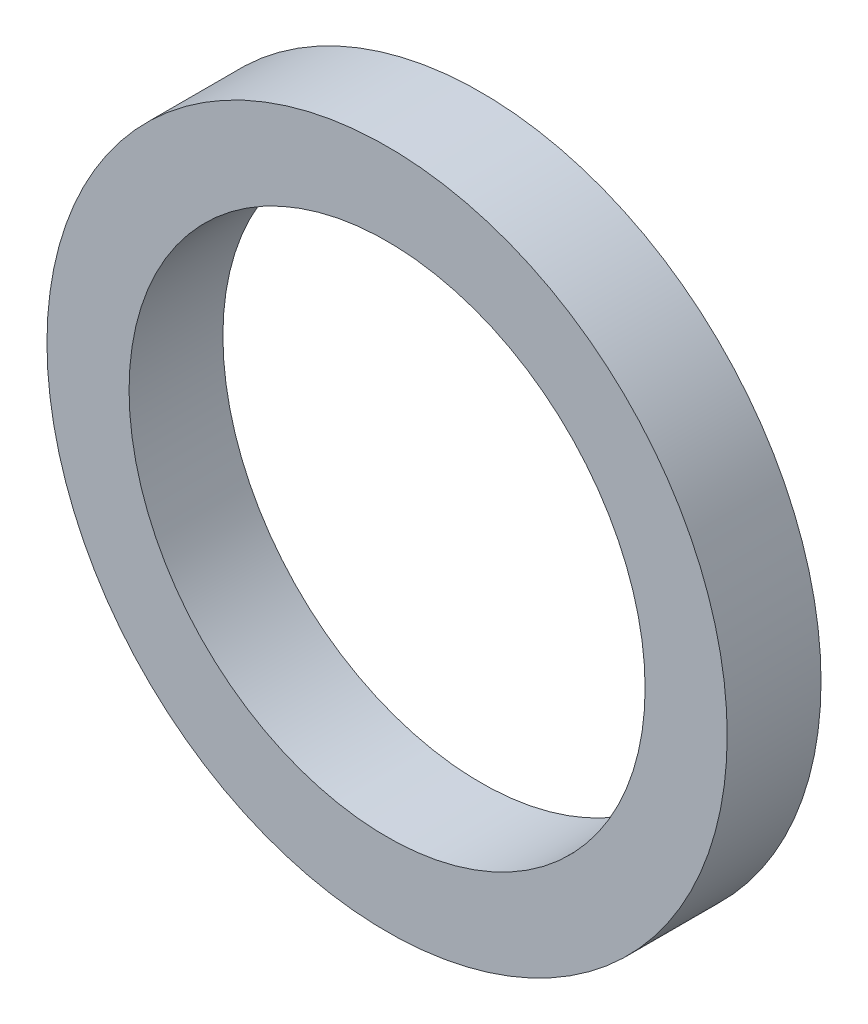
ISO-10303-21;
HEADER;
FILE_DESCRIPTION(('STEP AP214'),'2;1');
FILE_NAME('part.step','',(''),(''),'','','');
FILE_SCHEMA(('AUTOMOTIVE_DESIGN { 1 0 10303 214 1 1 1 1 }'));
ENDSEC;
DATA;
#1=APPLICATION_CONTEXT('core data for automotive mechanical design processes');
#2=APPLICATION_PROTOCOL_DEFINITION('international standard','automotive_design',2000,#1);
#3=PRODUCT_CONTEXT('',#1,'mechanical');
#4=PRODUCT('Part','Part','',(#3));
#5=PRODUCT_RELATED_PRODUCT_CATEGORY('part','',(#4));
#6=PRODUCT_DEFINITION_FORMATION('','',#4);
#7=PRODUCT_DEFINITION_CONTEXT('part definition',#1,'design');
#8=PRODUCT_DEFINITION('design','',#6,#7);
#9=PRODUCT_DEFINITION_SHAPE('','',#8);
#10=(LENGTH_UNIT() NAMED_UNIT(*) SI_UNIT(.MILLI.,.METRE.));
#11=(NAMED_UNIT(*) PLANE_ANGLE_UNIT() SI_UNIT($,.RADIAN.));
#12=(NAMED_UNIT(*) SI_UNIT($,.STERADIAN.) SOLID_ANGLE_UNIT());
#13=UNCERTAINTY_MEASURE_WITH_UNIT(LENGTH_MEASURE(1.E-05),#10,'distance_accuracy_value','');
#14=(GEOMETRIC_REPRESENTATION_CONTEXT(3) GLOBAL_UNCERTAINTY_ASSIGNED_CONTEXT((#13)) GLOBAL_UNIT_ASSIGNED_CONTEXT((#10,
#11,#12)) REPRESENTATION_CONTEXT('',''));
#15=CARTESIAN_POINT('',(0.,0.,0.));
#16=DIRECTION('',(0.,0.,1.));
#17=DIRECTION('',(1.,0.,0.));
#18=AXIS2_PLACEMENT_3D('',#15,#16,#17);
#19=CARTESIAN_POINT('',(0.,0.,0.));
#20=DIRECTION('',(0.,0.,1.));
#21=DIRECTION('',(1.,0.,0.));
#22=AXIS2_PLACEMENT_3D('',#19,#20,#21);
#23=PLANE('',#22);
#24=CARTESIAN_POINT('',(0.,0.,0.));
#25=DIRECTION('',(0.,0.,-1.));
#26=DIRECTION('',(1.,0.,0.));
#27=AXIS2_PLACEMENT_3D('',#24,#25,#26);
#28=CIRCLE('',#27,5.5);
#29=CARTESIAN_POINT('',(-5.50000000000001,0.,0.));
#30=VERTEX_POINT('',#29);
#31=EDGE_CURVE('E20',#30,#30,#28,.T.);
#32=ORIENTED_EDGE('',*,*,#31,.F.);
#33=EDGE_LOOP('',(#32));
#34=FACE_BOUND('',#33,.T.);
#35=CARTESIAN_POINT('',(0.,0.,0.));
#36=DIRECTION('',(0.,0.,1.));
#37=DIRECTION('',(1.,0.,0.));
#38=AXIS2_PLACEMENT_3D('',#35,#36,#37);
#39=CIRCLE('',#38,7.25);
#40=CARTESIAN_POINT('',(-7.25000000000001,0.,0.));
#41=VERTEX_POINT('',#40);
#42=EDGE_CURVE('E11',#41,#41,#39,.T.);
#43=ORIENTED_EDGE('',*,*,#42,.F.);
#44=EDGE_LOOP('',(#43));
#45=FACE_BOUND('',#44,.T.);
#46=ADVANCED_FACE('F17',(#34,#45),#23,.F.);
#47=CARTESIAN_POINT('',(0.,0.,2.));
#48=DIRECTION('',(0.,0.,1.));
#49=DIRECTION('',(1.,0.,0.));
#50=AXIS2_PLACEMENT_3D('',#47,#48,#49);
#51=PLANE('',#50);
#52=CARTESIAN_POINT('',(0.,0.,2.));
#53=DIRECTION('',(0.,0.,-1.));
#54=DIRECTION('',(1.,0.,0.));
#55=AXIS2_PLACEMENT_3D('',#52,#53,#54);
#56=CIRCLE('',#55,5.5);
#57=CARTESIAN_POINT('',(-5.50000000000001,0.,2.));
#58=VERTEX_POINT('',#57);
#59=EDGE_CURVE('E53',#58,#58,#56,.T.);
#60=ORIENTED_EDGE('',*,*,#59,.T.);
#61=EDGE_LOOP('',(#60));
#62=FACE_BOUND('',#61,.T.);
#63=CARTESIAN_POINT('',(0.,0.,2.));
#64=DIRECTION('',(0.,0.,1.));
#65=DIRECTION('',(1.,0.,0.));
#66=AXIS2_PLACEMENT_3D('',#63,#64,#65);
#67=CIRCLE('',#66,7.25);
#68=CARTESIAN_POINT('',(-7.25000000000001,0.,2.));
#69=VERTEX_POINT('',#68);
#70=EDGE_CURVE('E65',#69,#69,#67,.T.);
#71=ORIENTED_EDGE('',*,*,#70,.T.);
#72=EDGE_LOOP('',(#71));
#73=FACE_BOUND('',#72,.T.);
#74=ADVANCED_FACE('F58',(#62,#73),#51,.T.);
#75=CARTESIAN_POINT('',(0.,0.,0.));
#76=DIRECTION('',(0.,0.,1.));
#77=DIRECTION('',(1.,0.,0.));
#78=AXIS2_PLACEMENT_3D('',#75,#76,#77);
#79=CYLINDRICAL_SURFACE('',#78,7.25);
#80=ORIENTED_EDGE('',*,*,#70,.F.);
#81=DIRECTION('',(0.,0.,-1.));
#82=VECTOR('',#81,1.);
#83=CARTESIAN_POINT('',(-7.25000000000001,0.,0.));
#84=LINE('',#83,#82);
#85=EDGE_CURVE('E27',#69,#41,#84,.T.);
#86=ORIENTED_EDGE('',*,*,#85,.T.);
#87=ORIENTED_EDGE('',*,*,#42,.T.);
#88=ORIENTED_EDGE('',*,*,#85,.F.);
#89=EDGE_LOOP('',(#80,#86,#87,#88));
#90=FACE_BOUND('',#89,.T.);
#91=ADVANCED_FACE('F73',(#90),#79,.T.);
#92=CARTESIAN_POINT('',(0.,0.,0.));
#93=DIRECTION('',(0.,0.,1.));
#94=DIRECTION('',(1.,0.,0.));
#95=AXIS2_PLACEMENT_3D('',#92,#93,#94);
#96=CYLINDRICAL_SURFACE('',#95,5.5);
#97=ORIENTED_EDGE('',*,*,#59,.F.);
#98=DIRECTION('',(0.,0.,-1.));
#99=VECTOR('',#98,1.);
#100=CARTESIAN_POINT('',(-5.50000000000001,0.,0.));
#101=LINE('',#100,#99);
#102=EDGE_CURVE('E50',#58,#30,#101,.T.);
#103=ORIENTED_EDGE('',*,*,#102,.T.);
#104=ORIENTED_EDGE('',*,*,#31,.T.);
#105=ORIENTED_EDGE('',*,*,#102,.F.);
#106=EDGE_LOOP('',(#97,#103,#104,#105));
#107=FACE_BOUND('',#106,.T.);
#108=ADVANCED_FACE('F52',(#107),#96,.F.);
#109=CLOSED_SHELL('',(#46,#74,#91,#108));
#110=MANIFOLD_SOLID_BREP('B1',#109);
#111=ADVANCED_BREP_SHAPE_REPRESENTATION('',(#18,#110),#14);
#112=SHAPE_DEFINITION_REPRESENTATION(#9,#111);
ENDSEC;
END-ISO-10303-21;
